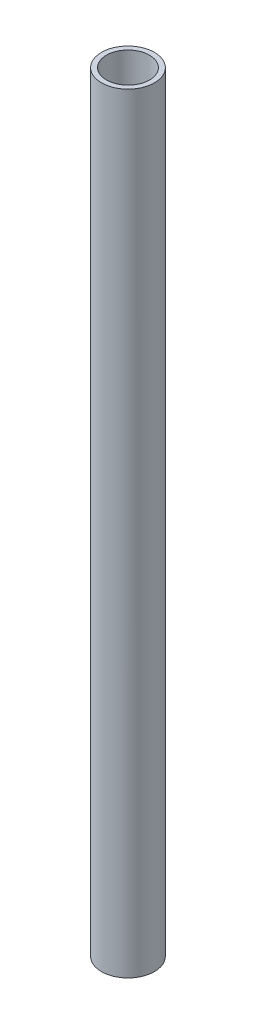
ISO-10303-21;
HEADER;
FILE_DESCRIPTION(('STEP AP214'),'2;1');
FILE_NAME('part.step','',(''),(''),'','','');
FILE_SCHEMA(('AUTOMOTIVE_DESIGN { 1 0 10303 214 1 1 1 1 }'));
ENDSEC;
DATA;
#1=APPLICATION_CONTEXT('core data for automotive mechanical design processes');
#2=APPLICATION_PROTOCOL_DEFINITION('international standard','automotive_design',2000,#1);
#3=PRODUCT_CONTEXT('',#1,'mechanical');
#4=PRODUCT('Part','Part','',(#3));
#5=PRODUCT_RELATED_PRODUCT_CATEGORY('part','',(#4));
#6=PRODUCT_DEFINITION_FORMATION('','',#4);
#7=PRODUCT_DEFINITION_CONTEXT('part definition',#1,'design');
#8=PRODUCT_DEFINITION('design','',#6,#7);
#9=PRODUCT_DEFINITION_SHAPE('','',#8);
#10=(LENGTH_UNIT() NAMED_UNIT(*) SI_UNIT(.MILLI.,.METRE.));
#11=(NAMED_UNIT(*) PLANE_ANGLE_UNIT() SI_UNIT($,.RADIAN.));
#12=(NAMED_UNIT(*) SI_UNIT($,.STERADIAN.) SOLID_ANGLE_UNIT());
#13=UNCERTAINTY_MEASURE_WITH_UNIT(LENGTH_MEASURE(1.E-05),#10,'distance_accuracy_value','');
#14=(GEOMETRIC_REPRESENTATION_CONTEXT(3) GLOBAL_UNCERTAINTY_ASSIGNED_CONTEXT((#13)) GLOBAL_UNIT_ASSIGNED_CONTEXT((#10,
#11,#12)) REPRESENTATION_CONTEXT('',''));
#15=CARTESIAN_POINT('',(0.,0.,0.));
#16=DIRECTION('',(0.,0.,1.));
#17=DIRECTION('',(1.,0.,0.));
#18=AXIS2_PLACEMENT_3D('',#15,#16,#17);
#19=CARTESIAN_POINT('',(0.,278.836161139961,0.));
#20=DIRECTION('',(0.,-1.,0.));
#21=DIRECTION('',(0.,0.,-1.));
#22=AXIS2_PLACEMENT_3D('',#19,#20,#21);
#23=CYLINDRICAL_SURFACE('',#22,7.9375);
#24=CARTESIAN_POINT('',(0.,0.,0.));
#25=DIRECTION('',(0.,1.,0.));
#26=DIRECTION('',(0.,0.,1.));
#27=AXIS2_PLACEMENT_3D('',#24,#25,#26);
#28=CIRCLE('',#27,7.9375);
#29=CARTESIAN_POINT('',(0.,0.,7.9375));
#30=VERTEX_POINT('',#29);
#31=EDGE_CURVE('E41',#30,#30,#28,.T.);
#32=ORIENTED_EDGE('',*,*,#31,.T.);
#33=EDGE_LOOP('',(#32));
#34=FACE_BOUND('',#33,.T.);
#35=CARTESIAN_POINT('',(0.,230.985520837288,0.));
#36=DIRECTION('',(0.,1.,0.));
#37=DIRECTION('',(-1.,0.,0.));
#38=AXIS2_PLACEMENT_3D('',#35,#36,#37);
#39=CIRCLE('',#38,7.9375);
#40=CARTESIAN_POINT('',(-7.9375,230.985520837288,0.));
#41=VERTEX_POINT('',#40);
#42=EDGE_CURVE('E11',#41,#41,#39,.T.);
#43=ORIENTED_EDGE('',*,*,#42,.F.);
#44=EDGE_LOOP('',(#43));
#45=FACE_BOUND('',#44,.T.);
#46=ADVANCED_FACE('F34',(#34,#45),#23,.T.);
#47=CARTESIAN_POINT('',(0.,0.,0.));
#48=DIRECTION('',(0.,1.,0.));
#49=DIRECTION('',(0.,0.,1.));
#50=AXIS2_PLACEMENT_3D('',#47,#48,#49);
#51=PLANE('',#50);
#52=ORIENTED_EDGE('',*,*,#31,.F.);
#53=EDGE_LOOP('',(#52));
#54=FACE_BOUND('',#53,.T.);
#55=CARTESIAN_POINT('',(0.,0.,0.));
#56=DIRECTION('',(0.,1.,0.));
#57=DIRECTION('',(0.,0.,1.));
#58=AXIS2_PLACEMENT_3D('',#55,#56,#57);
#59=CIRCLE('',#58,6.4643);
#60=CARTESIAN_POINT('',(0.,0.,6.4643));
#61=VERTEX_POINT('',#60);
#62=EDGE_CURVE('E46',#61,#61,#59,.T.);
#63=ORIENTED_EDGE('',*,*,#62,.T.);
#64=EDGE_LOOP('',(#63));
#65=FACE_BOUND('',#64,.T.);
#66=ADVANCED_FACE('F62',(#54,#65),#51,.F.);
#67=CARTESIAN_POINT('',(0.,278.836161139961,0.));
#68=DIRECTION('',(0.,-1.,0.));
#69=DIRECTION('',(0.,0.,-1.));
#70=AXIS2_PLACEMENT_3D('',#67,#68,#69);
#71=CYLINDRICAL_SURFACE('',#70,6.4643);
#72=ORIENTED_EDGE('',*,*,#62,.F.);
#73=EDGE_LOOP('',(#72));
#74=FACE_BOUND('',#73,.T.);
#75=CARTESIAN_POINT('',(0.,230.985520837288,0.));
#76=DIRECTION('',(0.,1.,0.));
#77=DIRECTION('',(-1.,0.,0.));
#78=AXIS2_PLACEMENT_3D('',#75,#76,#77);
#79=CIRCLE('',#78,6.4643);
#80=CARTESIAN_POINT('',(-6.4643,230.985520837288,0.));
#81=VERTEX_POINT('',#80);
#82=EDGE_CURVE('E37',#81,#81,#79,.T.);
#83=ORIENTED_EDGE('',*,*,#82,.T.);
#84=EDGE_LOOP('',(#83));
#85=FACE_BOUND('',#84,.T.);
#86=ADVANCED_FACE('F54',(#74,#85),#71,.F.);
#87=CARTESIAN_POINT('',(1.41794834523144E-13,230.985520837288,3.175));
#88=DIRECTION('',(0.,1.,0.));
#89=DIRECTION('',(-1.,0.,0.));
#90=AXIS2_PLACEMENT_3D('',#87,#88,#89);
#91=PLANE('',#90);
#92=ORIENTED_EDGE('',*,*,#82,.F.);
#93=EDGE_LOOP('',(#92));
#94=FACE_BOUND('',#93,.T.);
#95=ORIENTED_EDGE('',*,*,#42,.T.);
#96=EDGE_LOOP('',(#95));
#97=FACE_BOUND('',#96,.T.);
#98=ADVANCED_FACE('F56',(#94,#97),#91,.T.);
#99=CLOSED_SHELL('',(#46,#66,#86,#98));
#100=MANIFOLD_SOLID_BREP('B2',#99);
#101=ADVANCED_BREP_SHAPE_REPRESENTATION('',(#18,#100),#14);
#102=SHAPE_DEFINITION_REPRESENTATION(#9,#101);
ENDSEC;
END-ISO-10303-21;
